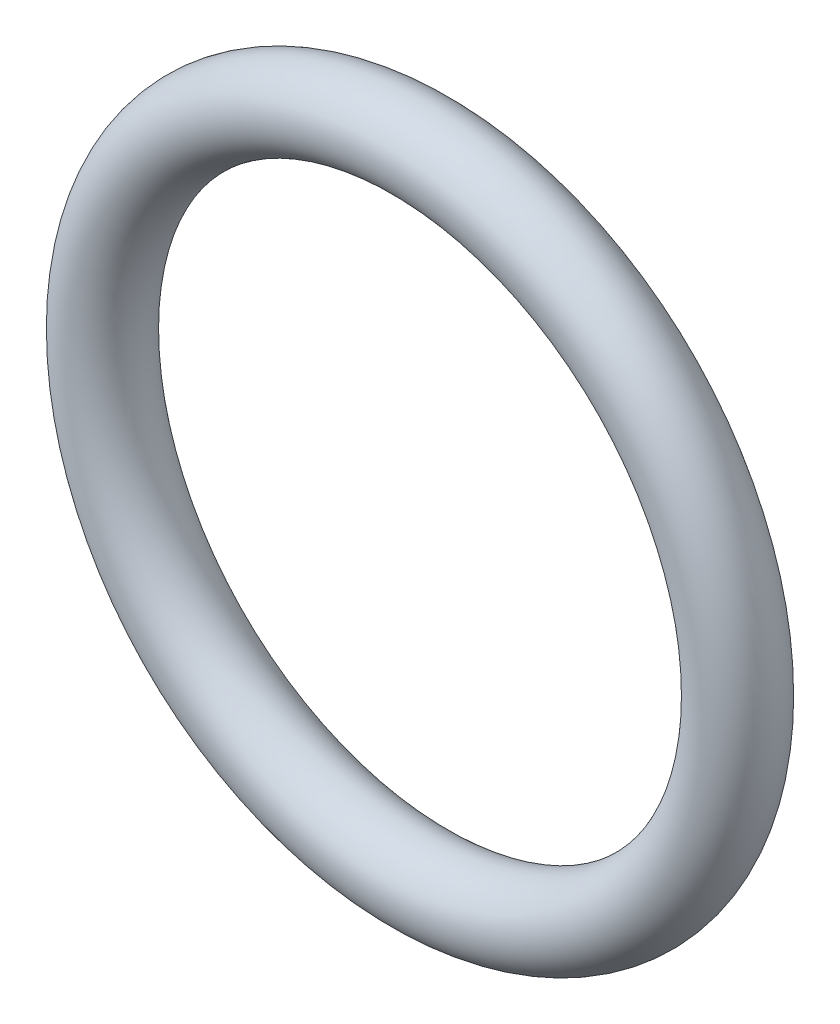
ISO-10303-21;
HEADER;
FILE_DESCRIPTION(('STEP AP214'),'2;1');
FILE_NAME('part.step','',(''),(''),'','','');
FILE_SCHEMA(('AUTOMOTIVE_DESIGN { 1 0 10303 214 1 1 1 1 }'));
ENDSEC;
DATA;
#1=APPLICATION_CONTEXT('core data for automotive mechanical design processes');
#2=APPLICATION_PROTOCOL_DEFINITION('international standard','automotive_design',2000,#1);
#3=PRODUCT_CONTEXT('',#1,'mechanical');
#4=PRODUCT('Part','Part','',(#3));
#5=PRODUCT_RELATED_PRODUCT_CATEGORY('part','',(#4));
#6=PRODUCT_DEFINITION_FORMATION('','',#4);
#7=PRODUCT_DEFINITION_CONTEXT('part definition',#1,'design');
#8=PRODUCT_DEFINITION('design','',#6,#7);
#9=PRODUCT_DEFINITION_SHAPE('','',#8);
#10=(LENGTH_UNIT() NAMED_UNIT(*) SI_UNIT(.MILLI.,.METRE.));
#11=(NAMED_UNIT(*) PLANE_ANGLE_UNIT() SI_UNIT($,.RADIAN.));
#12=(NAMED_UNIT(*) SI_UNIT($,.STERADIAN.) SOLID_ANGLE_UNIT());
#13=UNCERTAINTY_MEASURE_WITH_UNIT(LENGTH_MEASURE(1.E-05),#10,'distance_accuracy_value','');
#14=(GEOMETRIC_REPRESENTATION_CONTEXT(3) GLOBAL_UNCERTAINTY_ASSIGNED_CONTEXT((#13)) GLOBAL_UNIT_ASSIGNED_CONTEXT((#10,
#11,#12)) REPRESENTATION_CONTEXT('',''));
#15=CARTESIAN_POINT('',(0.,0.,0.));
#16=DIRECTION('',(0.,0.,1.));
#17=DIRECTION('',(1.,0.,0.));
#18=AXIS2_PLACEMENT_3D('',#15,#16,#17);
#19=CARTESIAN_POINT('',(0.,0.,0.));
#20=DIRECTION('',(0.,0.,1.));
#21=DIRECTION('',(1.,0.,0.));
#22=AXIS2_PLACEMENT_3D('',#19,#20,#21);
#23=TOROIDAL_SURFACE('',#22,16.,2.);
#24=CARTESIAN_POINT('',(-16.,0.,0.));
#25=DIRECTION('',(0.,1.,0.));
#26=DIRECTION('',(0.,0.,1.));
#27=AXIS2_PLACEMENT_3D('',#24,#25,#26);
#28=CIRCLE('',#27,2.);
#29=CARTESIAN_POINT('',(-18.,0.,0.));
#30=VERTEX_POINT('',#29);
#31=EDGE_CURVE('E10',#30,#30,#28,.T.);
#32=CARTESIAN_POINT('',(0.,0.,0.));
#33=DIRECTION('',(0.,0.,1.));
#34=DIRECTION('',(1.,0.,0.));
#35=AXIS2_PLACEMENT_3D('',#32,#33,#34);
#36=CIRCLE('',#35,18.);
#37=EDGE_CURVE('',#30,#30,#36,.T.);
#38=ORIENTED_EDGE('',*,*,#31,.F.);
#39=ORIENTED_EDGE('',*,*,#31,.T.);
#40=ORIENTED_EDGE('',*,*,#37,.T.);
#41=ORIENTED_EDGE('',*,*,#37,.F.);
#42=EDGE_LOOP('',(#38,#40,#39,#41));
#43=FACE_BOUND('',#42,.T.);
#44=ADVANCED_FACE('F35',(#43),#23,.T.);
#45=CLOSED_SHELL('',(#44));
#46=MANIFOLD_SOLID_BREP('B2',#45);
#47=ADVANCED_BREP_SHAPE_REPRESENTATION('',(#18,#46),#14);
#48=SHAPE_DEFINITION_REPRESENTATION(#9,#47);
ENDSEC;
END-ISO-10303-21;
